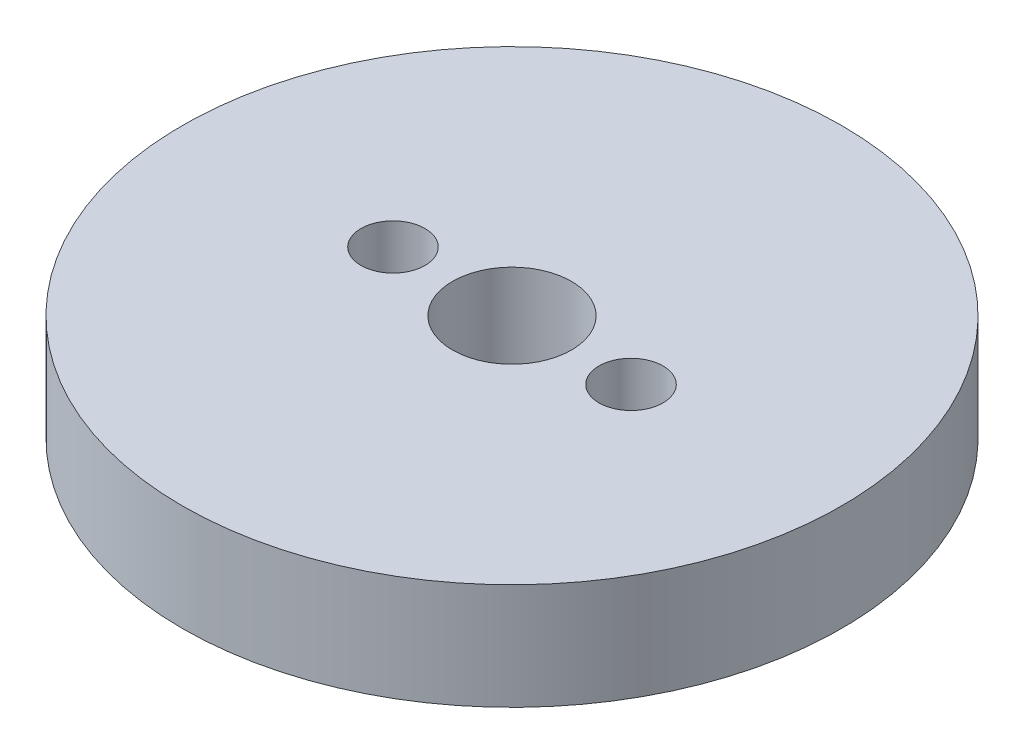
ISO-10303-21;
HEADER;
FILE_DESCRIPTION(('STEP AP214'),'2;1');
FILE_NAME('part.step','',(''),(''),'','','');
FILE_SCHEMA(('AUTOMOTIVE_DESIGN { 1 0 10303 214 1 1 1 1 }'));
ENDSEC;
DATA;
#1=APPLICATION_CONTEXT('core data for automotive mechanical design processes');
#2=APPLICATION_PROTOCOL_DEFINITION('international standard','automotive_design',2000,#1);
#3=PRODUCT_CONTEXT('',#1,'mechanical');
#4=PRODUCT('Part','Part','',(#3));
#5=PRODUCT_RELATED_PRODUCT_CATEGORY('part','',(#4));
#6=PRODUCT_DEFINITION_FORMATION('','',#4);
#7=PRODUCT_DEFINITION_CONTEXT('part definition',#1,'design');
#8=PRODUCT_DEFINITION('design','',#6,#7);
#9=PRODUCT_DEFINITION_SHAPE('','',#8);
#10=(LENGTH_UNIT() NAMED_UNIT(*) SI_UNIT(.MILLI.,.METRE.));
#11=(NAMED_UNIT(*) PLANE_ANGLE_UNIT() SI_UNIT($,.RADIAN.));
#12=(NAMED_UNIT(*) SI_UNIT($,.STERADIAN.) SOLID_ANGLE_UNIT());
#13=UNCERTAINTY_MEASURE_WITH_UNIT(LENGTH_MEASURE(1.E-05),#10,'distance_accuracy_value','');
#14=(GEOMETRIC_REPRESENTATION_CONTEXT(3) GLOBAL_UNCERTAINTY_ASSIGNED_CONTEXT((#13)) GLOBAL_UNIT_ASSIGNED_CONTEXT((#10,
#11,#12)) REPRESENTATION_CONTEXT('',''));
#15=CARTESIAN_POINT('',(0.,0.,0.));
#16=DIRECTION('',(0.,0.,1.));
#17=DIRECTION('',(1.,0.,0.));
#18=AXIS2_PLACEMENT_3D('',#15,#16,#17);
#19=CARTESIAN_POINT('',(0.,5.8,0.));
#20=DIRECTION('',(0.,1.,0.));
#21=DIRECTION('',(0.,0.,1.));
#22=AXIS2_PLACEMENT_3D('',#19,#20,#21);
#23=PLANE('',#22);
#24=CARTESIAN_POINT('',(6.5,5.8,0.));
#25=DIRECTION('',(0.,1.,0.));
#26=DIRECTION('',(0.,0.,1.));
#27=AXIS2_PLACEMENT_3D('',#24,#25,#26);
#28=CIRCLE('',#27,1.75);
#29=CARTESIAN_POINT('',(6.5,5.8,1.75));
#30=VERTEX_POINT('',#29);
#31=EDGE_CURVE('E48',#30,#30,#28,.T.);
#32=ORIENTED_EDGE('',*,*,#31,.F.);
#33=EDGE_LOOP('',(#32));
#34=FACE_BOUND('',#33,.T.);
#35=CARTESIAN_POINT('',(0.,5.8,0.));
#36=DIRECTION('',(0.,1.,0.));
#37=DIRECTION('',(0.,0.,1.));
#38=AXIS2_PLACEMENT_3D('',#35,#36,#37);
#39=CIRCLE('',#38,18.);
#40=CARTESIAN_POINT('',(0.,5.8,18.));
#41=VERTEX_POINT('',#40);
#42=EDGE_CURVE('E10',#41,#41,#39,.T.);
#43=ORIENTED_EDGE('',*,*,#42,.T.);
#44=EDGE_LOOP('',(#43));
#45=FACE_BOUND('',#44,.T.);
#46=CARTESIAN_POINT('',(0.,5.8,0.));
#47=DIRECTION('',(0.,1.,0.));
#48=DIRECTION('',(0.,0.,1.));
#49=AXIS2_PLACEMENT_3D('',#46,#47,#48);
#50=CIRCLE('',#49,3.25);
#51=CARTESIAN_POINT('',(0.,5.8,3.25));
#52=VERTEX_POINT('',#51);
#53=EDGE_CURVE('E43',#52,#52,#50,.T.);
#54=ORIENTED_EDGE('',*,*,#53,.F.);
#55=EDGE_LOOP('',(#54));
#56=FACE_BOUND('',#55,.T.);
#57=CARTESIAN_POINT('',(-6.5,5.8,0.));
#58=DIRECTION('',(0.,1.,0.));
#59=DIRECTION('',(0.,0.,-1.));
#60=AXIS2_PLACEMENT_3D('',#57,#58,#59);
#61=CIRCLE('',#60,1.75);
#62=CARTESIAN_POINT('',(-6.5,5.8,-1.75));
#63=VERTEX_POINT('',#62);
#64=EDGE_CURVE('E54',#63,#63,#61,.T.);
#65=ORIENTED_EDGE('',*,*,#64,.F.);
#66=EDGE_LOOP('',(#65));
#67=FACE_BOUND('',#66,.T.);
#68=ADVANCED_FACE('F32',(#34,#45,#56,#67),#23,.T.);
#69=CARTESIAN_POINT('',(0.,0.,0.));
#70=DIRECTION('',(0.,1.,0.));
#71=DIRECTION('',(0.,0.,1.));
#72=AXIS2_PLACEMENT_3D('',#69,#70,#71);
#73=PLANE('',#72);
#74=CARTESIAN_POINT('',(0.,0.,0.));
#75=DIRECTION('',(0.,1.,0.));
#76=DIRECTION('',(0.,0.,1.));
#77=AXIS2_PLACEMENT_3D('',#74,#75,#76);
#78=CIRCLE('',#77,18.);
#79=CARTESIAN_POINT('',(0.,0.,18.));
#80=VERTEX_POINT('',#79);
#81=EDGE_CURVE('E36',#80,#80,#78,.T.);
#82=ORIENTED_EDGE('',*,*,#81,.F.);
#83=EDGE_LOOP('',(#82));
#84=FACE_BOUND('',#83,.T.);
#85=CARTESIAN_POINT('',(0.,0.,0.));
#86=DIRECTION('',(0.,1.,0.));
#87=DIRECTION('',(0.,0.,1.));
#88=AXIS2_PLACEMENT_3D('',#85,#86,#87);
#89=CIRCLE('',#88,3.25);
#90=CARTESIAN_POINT('',(0.,0.,3.25));
#91=VERTEX_POINT('',#90);
#92=EDGE_CURVE('E45',#91,#91,#89,.T.);
#93=ORIENTED_EDGE('',*,*,#92,.T.);
#94=EDGE_LOOP('',(#93));
#95=FACE_BOUND('',#94,.T.);
#96=CARTESIAN_POINT('',(6.5,0.,0.));
#97=DIRECTION('',(0.,1.,0.));
#98=DIRECTION('',(0.,0.,1.));
#99=AXIS2_PLACEMENT_3D('',#96,#97,#98);
#100=CIRCLE('',#99,1.75);
#101=CARTESIAN_POINT('',(6.5,0.,1.75));
#102=VERTEX_POINT('',#101);
#103=EDGE_CURVE('E51',#102,#102,#100,.T.);
#104=ORIENTED_EDGE('',*,*,#103,.T.);
#105=EDGE_LOOP('',(#104));
#106=FACE_BOUND('',#105,.T.);
#107=CARTESIAN_POINT('',(-6.5,0.,0.));
#108=DIRECTION('',(0.,1.,0.));
#109=DIRECTION('',(0.,0.,-1.));
#110=AXIS2_PLACEMENT_3D('',#107,#108,#109);
#111=CIRCLE('',#110,1.75);
#112=CARTESIAN_POINT('',(-6.5,0.,-1.75));
#113=VERTEX_POINT('',#112);
#114=EDGE_CURVE('E57',#113,#113,#111,.T.);
#115=ORIENTED_EDGE('',*,*,#114,.T.);
#116=EDGE_LOOP('',(#115));
#117=FACE_BOUND('',#116,.T.);
#118=ADVANCED_FACE('F67',(#84,#95,#106,#117),#73,.F.);
#119=CARTESIAN_POINT('',(0.,5.8,0.));
#120=DIRECTION('',(0.,-1.,0.));
#121=DIRECTION('',(0.,0.,-1.));
#122=AXIS2_PLACEMENT_3D('',#119,#120,#121);
#123=CYLINDRICAL_SURFACE('',#122,18.);
#124=ORIENTED_EDGE('',*,*,#42,.F.);
#125=EDGE_LOOP('',(#124));
#126=FACE_BOUND('',#125,.T.);
#127=ORIENTED_EDGE('',*,*,#81,.T.);
#128=EDGE_LOOP('',(#127));
#129=FACE_BOUND('',#128,.T.);
#130=ADVANCED_FACE('F34',(#126,#129),#123,.T.);
#131=CARTESIAN_POINT('',(0.,5.8,0.));
#132=DIRECTION('',(0.,-1.,0.));
#133=DIRECTION('',(0.,0.,-1.));
#134=AXIS2_PLACEMENT_3D('',#131,#132,#133);
#135=CYLINDRICAL_SURFACE('',#134,3.25);
#136=ORIENTED_EDGE('',*,*,#53,.T.);
#137=EDGE_LOOP('',(#136));
#138=FACE_BOUND('',#137,.T.);
#139=ORIENTED_EDGE('',*,*,#92,.F.);
#140=EDGE_LOOP('',(#139));
#141=FACE_BOUND('',#140,.T.);
#142=ADVANCED_FACE('F76',(#138,#141),#135,.F.);
#143=CARTESIAN_POINT('',(6.5,5.8,0.));
#144=DIRECTION('',(0.,-1.,0.));
#145=DIRECTION('',(0.,0.,-1.));
#146=AXIS2_PLACEMENT_3D('',#143,#144,#145);
#147=CYLINDRICAL_SURFACE('',#146,1.75);
#148=ORIENTED_EDGE('',*,*,#31,.T.);
#149=EDGE_LOOP('',(#148));
#150=FACE_BOUND('',#149,.T.);
#151=ORIENTED_EDGE('',*,*,#103,.F.);
#152=EDGE_LOOP('',(#151));
#153=FACE_BOUND('',#152,.T.);
#154=ADVANCED_FACE('F79',(#150,#153),#147,.F.);
#155=CARTESIAN_POINT('',(-6.5,5.8,0.));
#156=DIRECTION('',(0.,-1.,0.));
#157=DIRECTION('',(0.,0.,-1.));
#158=AXIS2_PLACEMENT_3D('',#155,#156,#157);
#159=CYLINDRICAL_SURFACE('',#158,1.75);
#160=ORIENTED_EDGE('',*,*,#64,.T.);
#161=EDGE_LOOP('',(#160));
#162=FACE_BOUND('',#161,.T.);
#163=ORIENTED_EDGE('',*,*,#114,.F.);
#164=EDGE_LOOP('',(#163));
#165=FACE_BOUND('',#164,.T.);
#166=ADVANCED_FACE('F63',(#162,#165),#159,.F.);
#167=CLOSED_SHELL('',(#68,#118,#130,#142,#154,#166));
#168=MANIFOLD_SOLID_BREP('B2',#167);
#169=ADVANCED_BREP_SHAPE_REPRESENTATION('',(#18,#168),#14);
#170=SHAPE_DEFINITION_REPRESENTATION(#9,#169);
ENDSEC;
END-ISO-10303-21;
